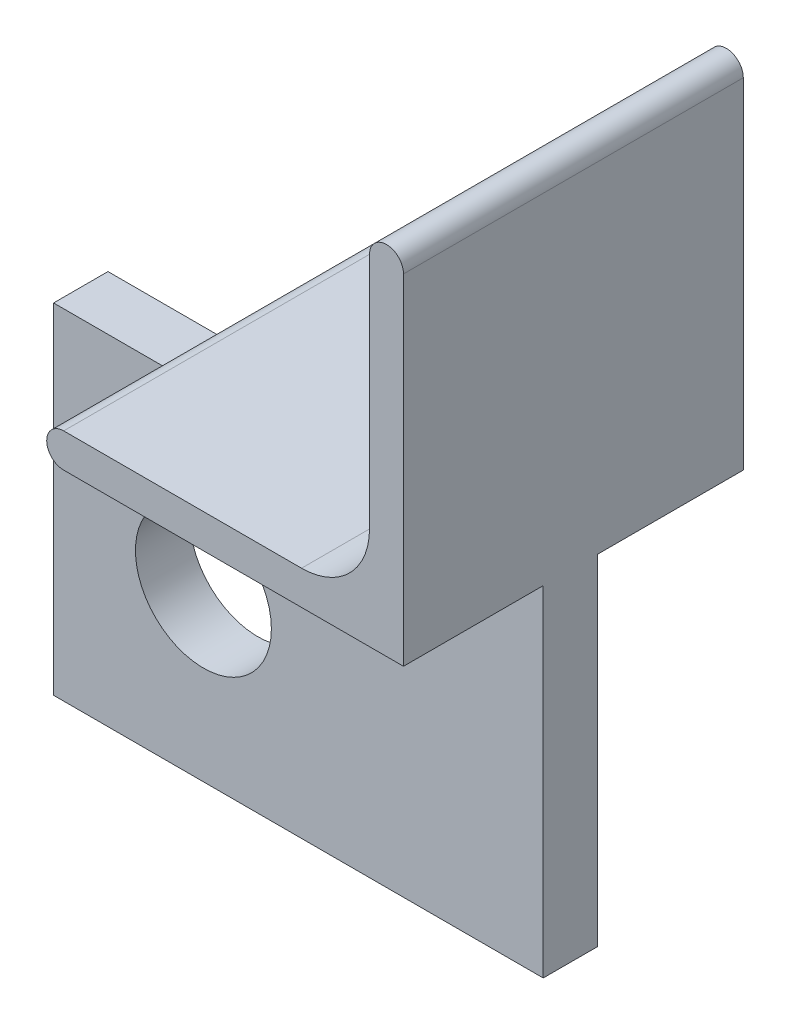
ISO-10303-21;
HEADER;
FILE_DESCRIPTION(('STEP AP214'),'2;1');
FILE_NAME('part.step','',(''),(''),'','','');
FILE_SCHEMA(('AUTOMOTIVE_DESIGN { 1 0 10303 214 1 1 1 1 }'));
ENDSEC;
DATA;
#1=APPLICATION_CONTEXT('core data for automotive mechanical design processes');
#2=APPLICATION_PROTOCOL_DEFINITION('international standard','automotive_design',2000,#1);
#3=PRODUCT_CONTEXT('',#1,'mechanical');
#4=PRODUCT('Part','Part','',(#3));
#5=PRODUCT_RELATED_PRODUCT_CATEGORY('part','',(#4));
#6=PRODUCT_DEFINITION_FORMATION('','',#4);
#7=PRODUCT_DEFINITION_CONTEXT('part definition',#1,'design');
#8=PRODUCT_DEFINITION('design','',#6,#7);
#9=PRODUCT_DEFINITION_SHAPE('','',#8);
#10=(LENGTH_UNIT() NAMED_UNIT(*) SI_UNIT(.MILLI.,.METRE.));
#11=(NAMED_UNIT(*) PLANE_ANGLE_UNIT() SI_UNIT($,.RADIAN.));
#12=(NAMED_UNIT(*) SI_UNIT($,.STERADIAN.) SOLID_ANGLE_UNIT());
#13=UNCERTAINTY_MEASURE_WITH_UNIT(LENGTH_MEASURE(1.E-05),#10,'distance_accuracy_value','');
#14=(GEOMETRIC_REPRESENTATION_CONTEXT(3) GLOBAL_UNCERTAINTY_ASSIGNED_CONTEXT((#13)) GLOBAL_UNIT_ASSIGNED_CONTEXT((#10,
#11,#12)) REPRESENTATION_CONTEXT('',''));
#15=CARTESIAN_POINT('',(0.,0.,0.));
#16=DIRECTION('',(0.,0.,1.));
#17=DIRECTION('',(1.,0.,0.));
#18=AXIS2_PLACEMENT_3D('',#15,#16,#17);
#19=CARTESIAN_POINT('',(0.,0.,25.));
#20=DIRECTION('',(0.,1.,0.));
#21=DIRECTION('',(0.,0.,1.));
#22=AXIS2_PLACEMENT_3D('',#19,#20,#21);
#23=PLANE('',#22);
#24=DIRECTION('',(1.,0.,0.));
#25=VECTOR('',#24,1.);
#26=CARTESIAN_POINT('',(-22.0449248055374,0.,-3.56003445408045));
#27=LINE('',#26,#25);
#28=CARTESIAN_POINT('',(0.,0.,-3.56003445408045));
#29=VERTEX_POINT('',#28);
#30=CARTESIAN_POINT('',(50.,0.,-3.56003445408045));
#31=VERTEX_POINT('',#30);
#32=EDGE_CURVE('E201',#29,#31,#27,.T.);
#33=ORIENTED_EDGE('',*,*,#32,.F.);
#34=DIRECTION('',(0.,0.,-1.));
#35=VECTOR('',#34,1.);
#36=CARTESIAN_POINT('',(0.,0.,25.));
#37=LINE('',#36,#35);
#38=CARTESIAN_POINT('',(0.,0.,-25.));
#39=VERTEX_POINT('',#38);
#40=EDGE_CURVE('E41',#29,#39,#37,.T.);
#41=ORIENTED_EDGE('',*,*,#40,.T.);
#42=DIRECTION('',(1.,0.,0.));
#43=VECTOR('',#42,1.);
#44=CARTESIAN_POINT('',(0.,0.,-25.));
#45=LINE('',#44,#43);
#46=CARTESIAN_POINT('',(50.,0.,-25.));
#47=VERTEX_POINT('',#46);
#48=EDGE_CURVE('E137',#39,#47,#45,.T.);
#49=ORIENTED_EDGE('',*,*,#48,.T.);
#50=DIRECTION('',(0.,0.,-1.));
#51=VECTOR('',#50,1.);
#52=CARTESIAN_POINT('',(50.,0.,25.));
#53=LINE('',#52,#51);
#54=EDGE_CURVE('E155',#31,#47,#53,.T.);
#55=ORIENTED_EDGE('',*,*,#54,.F.);
#56=EDGE_LOOP('',(#33,#41,#49,#55));
#57=FACE_BOUND('',#56,.T.);
#58=ADVANCED_FACE('F33',(#57),#23,.F.);
#59=DIRECTION('',(-1.,0.,0.));
#60=VECTOR('',#59,1.);
#61=CARTESIAN_POINT('',(-22.0449248055374,0.,4.43996554591955));
#62=LINE('',#61,#60);
#63=CARTESIAN_POINT('',(50.,0.,4.43996554591955));
#64=VERTEX_POINT('',#63);
#65=CARTESIAN_POINT('',(0.,0.,4.43996554591955));
#66=VERTEX_POINT('',#65);
#67=EDGE_CURVE('E193',#64,#66,#62,.T.);
#68=ORIENTED_EDGE('',*,*,#67,.F.);
#69=CARTESIAN_POINT('',(50.,0.,25.));
#70=VERTEX_POINT('',#69);
#71=EDGE_CURVE('E156',#70,#64,#53,.T.);
#72=ORIENTED_EDGE('',*,*,#71,.F.);
#73=DIRECTION('',(1.,0.,0.));
#74=VECTOR('',#73,1.);
#75=CARTESIAN_POINT('',(0.,0.,25.));
#76=LINE('',#75,#74);
#77=CARTESIAN_POINT('',(0.,0.,25.));
#78=VERTEX_POINT('',#77);
#79=EDGE_CURVE('E94',#78,#70,#76,.T.);
#80=ORIENTED_EDGE('',*,*,#79,.F.);
#81=EDGE_CURVE('E11',#78,#66,#37,.T.);
#82=ORIENTED_EDGE('',*,*,#81,.T.);
#83=EDGE_LOOP('',(#68,#72,#80,#82));
#84=FACE_BOUND('',#83,.T.);
#85=ADVANCED_FACE('F245',(#84),#23,.F.);
#86=CARTESIAN_POINT('',(0.,2.5,25.));
#87=DIRECTION('',(0.,0.,-1.));
#88=DIRECTION('',(-1.,0.,0.));
#89=AXIS2_PLACEMENT_3D('',#86,#87,#88);
#90=CYLINDRICAL_SURFACE('',#89,2.5);
#91=CARTESIAN_POINT('',(0.,2.5,-25.));
#92=DIRECTION('',(0.,0.,1.));
#93=DIRECTION('',(-1.,0.,0.));
#94=AXIS2_PLACEMENT_3D('',#91,#92,#93);
#95=CIRCLE('',#94,2.5);
#96=CARTESIAN_POINT('',(0.,5.,-25.));
#97=VERTEX_POINT('',#96);
#98=EDGE_CURVE('E134',#97,#39,#95,.T.);
#99=ORIENTED_EDGE('',*,*,#98,.T.);
#100=ORIENTED_EDGE('',*,*,#40,.F.);
#101=DIRECTION('',(0.,0.,-1.));
#102=VECTOR('',#101,1.);
#103=CARTESIAN_POINT('',(0.,0.,25.));
#104=LINE('',#103,#102);
#105=EDGE_CURVE('E138',#66,#29,#104,.T.);
#106=ORIENTED_EDGE('',*,*,#105,.F.);
#107=ORIENTED_EDGE('',*,*,#81,.F.);
#108=CARTESIAN_POINT('',(0.,2.5,25.));
#109=DIRECTION('',(0.,0.,1.));
#110=DIRECTION('',(-1.,0.,0.));
#111=AXIS2_PLACEMENT_3D('',#108,#109,#110);
#112=CIRCLE('',#111,2.5);
#113=CARTESIAN_POINT('',(0.,5.,25.));
#114=VERTEX_POINT('',#113);
#115=EDGE_CURVE('E149',#114,#78,#112,.T.);
#116=ORIENTED_EDGE('',*,*,#115,.F.);
#117=DIRECTION('',(0.,0.,-1.));
#118=VECTOR('',#117,1.);
#119=CARTESIAN_POINT('',(0.,5.,25.));
#120=LINE('',#119,#118);
#121=EDGE_CURVE('E130',#114,#97,#120,.T.);
#122=ORIENTED_EDGE('',*,*,#121,.T.);
#123=EDGE_LOOP('',(#99,#100,#106,#107,#116,#122));
#124=FACE_BOUND('',#123,.T.);
#125=ADVANCED_FACE('F35',(#124),#90,.T.);
#126=CARTESIAN_POINT('',(50.,0.,25.));
#127=DIRECTION('',(-1.,0.,0.));
#128=DIRECTION('',(0.,0.,1.));
#129=AXIS2_PLACEMENT_3D('',#126,#127,#128);
#130=PLANE('',#129);
#131=DIRECTION('',(0.,1.,0.));
#132=VECTOR('',#131,1.);
#133=CARTESIAN_POINT('',(50.,0.,-25.));
#134=LINE('',#133,#132);
#135=CARTESIAN_POINT('',(50.,50.,-25.));
#136=VERTEX_POINT('',#135);
#137=EDGE_CURVE('E141',#47,#136,#134,.T.);
#138=ORIENTED_EDGE('',*,*,#137,.T.);
#139=DIRECTION('',(0.,0.,-1.));
#140=VECTOR('',#139,1.);
#141=CARTESIAN_POINT('',(50.,50.,25.));
#142=LINE('',#141,#140);
#143=CARTESIAN_POINT('',(50.,50.,25.));
#144=VERTEX_POINT('',#143);
#145=EDGE_CURVE('E153',#144,#136,#142,.T.);
#146=ORIENTED_EDGE('',*,*,#145,.F.);
#147=DIRECTION('',(0.,1.,0.));
#148=VECTOR('',#147,1.);
#149=CARTESIAN_POINT('',(50.,0.,25.));
#150=LINE('',#149,#148);
#151=EDGE_CURVE('E175',#70,#144,#150,.T.);
#152=ORIENTED_EDGE('',*,*,#151,.F.);
#153=ORIENTED_EDGE('',*,*,#71,.T.);
#154=DIRECTION('',(0.,1.,0.));
#155=VECTOR('',#154,1.);
#156=CARTESIAN_POINT('',(50.,-50.,4.43996554591955));
#157=LINE('',#156,#155);
#158=CARTESIAN_POINT('',(50.,-50.,4.43996554591955));
#159=VERTEX_POINT('',#158);
#160=EDGE_CURVE('E186',#159,#64,#157,.T.);
#161=ORIENTED_EDGE('',*,*,#160,.F.);
#162=DIRECTION('',(0.,0.,1.));
#163=VECTOR('',#162,1.);
#164=CARTESIAN_POINT('',(50.,-50.,4.43996554591955));
#165=LINE('',#164,#163);
#166=CARTESIAN_POINT('',(50.,-50.,-3.56003445408045));
#167=VERTEX_POINT('',#166);
#168=EDGE_CURVE('E208',#167,#159,#165,.T.);
#169=ORIENTED_EDGE('',*,*,#168,.F.);
#170=DIRECTION('',(0.,1.,0.));
#171=VECTOR('',#170,1.);
#172=CARTESIAN_POINT('',(50.,-50.,-3.56003445408045));
#173=LINE('',#172,#171);
#174=EDGE_CURVE('E48',#167,#31,#173,.T.);
#175=ORIENTED_EDGE('',*,*,#174,.T.);
#176=ORIENTED_EDGE('',*,*,#54,.T.);
#177=EDGE_LOOP('',(#138,#146,#152,#153,#161,#169,#175,#176));
#178=FACE_BOUND('',#177,.T.);
#179=ADVANCED_FACE('F162',(#178),#130,.F.);
#180=CARTESIAN_POINT('',(47.5,50.,25.));
#181=DIRECTION('',(0.,0.,-1.));
#182=DIRECTION('',(-1.,0.,0.));
#183=AXIS2_PLACEMENT_3D('',#180,#181,#182);
#184=CYLINDRICAL_SURFACE('',#183,2.5);
#185=CARTESIAN_POINT('',(47.5,50.,-25.));
#186=DIRECTION('',(0.,0.,1.));
#187=DIRECTION('',(1.,0.,0.));
#188=AXIS2_PLACEMENT_3D('',#185,#186,#187);
#189=CIRCLE('',#188,2.5);
#190=CARTESIAN_POINT('',(45.,50.,-25.));
#191=VERTEX_POINT('',#190);
#192=EDGE_CURVE('E143',#136,#191,#189,.T.);
#193=ORIENTED_EDGE('',*,*,#192,.T.);
#194=DIRECTION('',(0.,0.,-1.));
#195=VECTOR('',#194,1.);
#196=CARTESIAN_POINT('',(45.,50.,25.));
#197=LINE('',#196,#195);
#198=CARTESIAN_POINT('',(45.,50.,25.));
#199=VERTEX_POINT('',#198);
#200=EDGE_CURVE('E125',#199,#191,#197,.T.);
#201=ORIENTED_EDGE('',*,*,#200,.F.);
#202=CARTESIAN_POINT('',(47.5,50.,25.));
#203=DIRECTION('',(0.,0.,1.));
#204=DIRECTION('',(1.,0.,0.));
#205=AXIS2_PLACEMENT_3D('',#202,#203,#204);
#206=CIRCLE('',#205,2.5);
#207=EDGE_CURVE('E113',#144,#199,#206,.T.);
#208=ORIENTED_EDGE('',*,*,#207,.F.);
#209=ORIENTED_EDGE('',*,*,#145,.T.);
#210=EDGE_LOOP('',(#193,#201,#208,#209));
#211=FACE_BOUND('',#210,.T.);
#212=ADVANCED_FACE('F174',(#211),#184,.T.);
#213=CARTESIAN_POINT('',(45.,15.0000000000001,25.));
#214=DIRECTION('',(1.,0.,0.));
#215=DIRECTION('',(0.,0.,-1.));
#216=AXIS2_PLACEMENT_3D('',#213,#214,#215);
#217=PLANE('',#216);
#218=DIRECTION('',(0.,-1.,0.));
#219=VECTOR('',#218,1.);
#220=CARTESIAN_POINT('',(45.,15.0000000000001,-25.));
#221=LINE('',#220,#219);
#222=CARTESIAN_POINT('',(45.,15.0000000000001,-25.));
#223=VERTEX_POINT('',#222);
#224=EDGE_CURVE('E122',#191,#223,#221,.T.);
#225=ORIENTED_EDGE('',*,*,#224,.T.);
#226=DIRECTION('',(0.,0.,-1.));
#227=VECTOR('',#226,1.);
#228=CARTESIAN_POINT('',(45.,15.0000000000001,25.));
#229=LINE('',#228,#227);
#230=CARTESIAN_POINT('',(45.,15.0000000000001,25.));
#231=VERTEX_POINT('',#230);
#232=EDGE_CURVE('E119',#231,#223,#229,.T.);
#233=ORIENTED_EDGE('',*,*,#232,.F.);
#234=DIRECTION('',(0.,-1.,0.));
#235=VECTOR('',#234,1.);
#236=CARTESIAN_POINT('',(45.,15.0000000000001,25.));
#237=LINE('',#236,#235);
#238=EDGE_CURVE('E106',#199,#231,#237,.T.);
#239=ORIENTED_EDGE('',*,*,#238,.F.);
#240=ORIENTED_EDGE('',*,*,#200,.T.);
#241=EDGE_LOOP('',(#225,#233,#239,#240));
#242=FACE_BOUND('',#241,.T.);
#243=ADVANCED_FACE('F120',(#242),#217,.F.);
#244=CARTESIAN_POINT('',(35.,15.,25.));
#245=DIRECTION('',(0.,0.,-1.));
#246=DIRECTION('',(-1.,0.,0.));
#247=AXIS2_PLACEMENT_3D('',#244,#245,#246);
#248=CYLINDRICAL_SURFACE('',#247,10.);
#249=CARTESIAN_POINT('',(35.,15.,-25.));
#250=DIRECTION('',(0.,0.,-1.));
#251=DIRECTION('',(1.,0.,0.));
#252=AXIS2_PLACEMENT_3D('',#249,#250,#251);
#253=CIRCLE('',#252,10.);
#254=CARTESIAN_POINT('',(34.9999999999999,5.,-25.));
#255=VERTEX_POINT('',#254);
#256=EDGE_CURVE('E146',#223,#255,#253,.T.);
#257=ORIENTED_EDGE('',*,*,#256,.T.);
#258=DIRECTION('',(0.,0.,-1.));
#259=VECTOR('',#258,1.);
#260=CARTESIAN_POINT('',(34.9999999999999,5.,25.));
#261=LINE('',#260,#259);
#262=CARTESIAN_POINT('',(34.9999999999999,5.,25.));
#263=VERTEX_POINT('',#262);
#264=EDGE_CURVE('E126',#263,#255,#261,.T.);
#265=ORIENTED_EDGE('',*,*,#264,.F.);
#266=CARTESIAN_POINT('',(35.,15.,25.));
#267=DIRECTION('',(0.,0.,-1.));
#268=DIRECTION('',(1.,0.,0.));
#269=AXIS2_PLACEMENT_3D('',#266,#267,#268);
#270=CIRCLE('',#269,10.);
#271=EDGE_CURVE('E110',#231,#263,#270,.T.);
#272=ORIENTED_EDGE('',*,*,#271,.F.);
#273=ORIENTED_EDGE('',*,*,#232,.T.);
#274=EDGE_LOOP('',(#257,#265,#272,#273));
#275=FACE_BOUND('',#274,.T.);
#276=ADVANCED_FACE('F128',(#275),#248,.F.);
#277=CARTESIAN_POINT('',(0.,5.,25.));
#278=DIRECTION('',(0.,-1.,0.));
#279=DIRECTION('',(0.,0.,-1.));
#280=AXIS2_PLACEMENT_3D('',#277,#278,#279);
#281=PLANE('',#280);
#282=DIRECTION('',(-1.,0.,0.));
#283=VECTOR('',#282,1.);
#284=CARTESIAN_POINT('',(0.,5.,-25.));
#285=LINE('',#284,#283);
#286=EDGE_CURVE('E86',#255,#97,#285,.T.);
#287=ORIENTED_EDGE('',*,*,#286,.T.);
#288=ORIENTED_EDGE('',*,*,#121,.F.);
#289=DIRECTION('',(-1.,0.,0.));
#290=VECTOR('',#289,1.);
#291=CARTESIAN_POINT('',(0.,5.,25.));
#292=LINE('',#291,#290);
#293=EDGE_CURVE('E57',#263,#114,#292,.T.);
#294=ORIENTED_EDGE('',*,*,#293,.F.);
#295=ORIENTED_EDGE('',*,*,#264,.T.);
#296=EDGE_LOOP('',(#287,#288,#294,#295));
#297=FACE_BOUND('',#296,.T.);
#298=ADVANCED_FACE('F260',(#297),#281,.F.);
#299=CARTESIAN_POINT('',(0.,2.5,25.));
#300=DIRECTION('',(0.,0.,-1.));
#301=DIRECTION('',(-1.,0.,0.));
#302=AXIS2_PLACEMENT_3D('',#299,#300,#301);
#303=PLANE('',#302);
#304=ORIENTED_EDGE('',*,*,#115,.T.);
#305=ORIENTED_EDGE('',*,*,#79,.T.);
#306=ORIENTED_EDGE('',*,*,#151,.T.);
#307=ORIENTED_EDGE('',*,*,#207,.T.);
#308=ORIENTED_EDGE('',*,*,#238,.T.);
#309=ORIENTED_EDGE('',*,*,#271,.T.);
#310=ORIENTED_EDGE('',*,*,#293,.T.);
#311=EDGE_LOOP('',(#304,#305,#306,#307,#308,#309,#310));
#312=FACE_BOUND('',#311,.T.);
#313=ADVANCED_FACE('F108',(#312),#303,.F.);
#314=CARTESIAN_POINT('',(0.,2.5,-25.));
#315=DIRECTION('',(0.,0.,-1.));
#316=DIRECTION('',(-1.,0.,0.));
#317=AXIS2_PLACEMENT_3D('',#314,#315,#316);
#318=PLANE('',#317);
#319=ORIENTED_EDGE('',*,*,#98,.F.);
#320=ORIENTED_EDGE('',*,*,#286,.F.);
#321=ORIENTED_EDGE('',*,*,#256,.F.);
#322=ORIENTED_EDGE('',*,*,#224,.F.);
#323=ORIENTED_EDGE('',*,*,#192,.F.);
#324=ORIENTED_EDGE('',*,*,#137,.F.);
#325=ORIENTED_EDGE('',*,*,#48,.F.);
#326=EDGE_LOOP('',(#319,#320,#321,#322,#323,#324,#325));
#327=FACE_BOUND('',#326,.T.);
#328=ADVANCED_FACE('F172',(#327),#318,.T.);
#329=CARTESIAN_POINT('',(0.,0.,0.));
#330=DIRECTION('',(0.,-1.,0.));
#331=DIRECTION('',(0.,0.,-1.));
#332=AXIS2_PLACEMENT_3D('',#329,#330,#331);
#333=PLANE('',#332);
#334=CARTESIAN_POINT('',(-22.0449248055374,0.,4.43996554591955));
#335=VERTEX_POINT('',#334);
#336=EDGE_CURVE('E197',#66,#335,#62,.T.);
#337=ORIENTED_EDGE('',*,*,#336,.F.);
#338=ORIENTED_EDGE('',*,*,#105,.T.);
#339=CARTESIAN_POINT('',(-22.0449248055374,0.,-3.56003445408045));
#340=VERTEX_POINT('',#339);
#341=EDGE_CURVE('E198',#340,#29,#27,.T.);
#342=ORIENTED_EDGE('',*,*,#341,.F.);
#343=DIRECTION('',(0.,0.,-1.));
#344=VECTOR('',#343,1.);
#345=CARTESIAN_POINT('',(-22.0449248055374,0.,4.43996554591955));
#346=LINE('',#345,#344);
#347=EDGE_CURVE('E202',#335,#340,#346,.T.);
#348=ORIENTED_EDGE('',*,*,#347,.F.);
#349=EDGE_LOOP('',(#337,#338,#342,#348));
#350=FACE_BOUND('',#349,.T.);
#351=ADVANCED_FACE('F265',(#350),#333,.F.);
#352=CARTESIAN_POINT('',(-22.0449248055374,-50.,4.43996554591955));
#353=DIRECTION('',(1.,0.,0.));
#354=DIRECTION('',(0.,0.,-1.));
#355=AXIS2_PLACEMENT_3D('',#352,#353,#354);
#356=PLANE('',#355);
#357=ORIENTED_EDGE('',*,*,#347,.T.);
#358=DIRECTION('',(0.,1.,0.));
#359=VECTOR('',#358,1.);
#360=CARTESIAN_POINT('',(-22.0449248055374,-50.,-3.56003445408045));
#361=LINE('',#360,#359);
#362=CARTESIAN_POINT('',(-22.0449248055374,-50.,-3.56003445408045));
#363=VERTEX_POINT('',#362);
#364=EDGE_CURVE('E182',#363,#340,#361,.T.);
#365=ORIENTED_EDGE('',*,*,#364,.F.);
#366=DIRECTION('',(0.,0.,-1.));
#367=VECTOR('',#366,1.);
#368=CARTESIAN_POINT('',(-22.0449248055374,-50.,4.43996554591955));
#369=LINE('',#368,#367);
#370=CARTESIAN_POINT('',(-22.0449248055374,-50.,4.43996554591955));
#371=VERTEX_POINT('',#370);
#372=EDGE_CURVE('E196',#371,#363,#369,.T.);
#373=ORIENTED_EDGE('',*,*,#372,.F.);
#374=DIRECTION('',(0.,1.,0.));
#375=VECTOR('',#374,1.);
#376=CARTESIAN_POINT('',(-22.0449248055374,-50.,4.43996554591955));
#377=LINE('',#376,#375);
#378=EDGE_CURVE('E189',#371,#335,#377,.T.);
#379=ORIENTED_EDGE('',*,*,#378,.T.);
#380=EDGE_LOOP('',(#357,#365,#373,#379));
#381=FACE_BOUND('',#380,.T.);
#382=ADVANCED_FACE('F268',(#381),#356,.F.);
#383=CARTESIAN_POINT('',(-22.0449248055374,-50.,-3.56003445408045));
#384=DIRECTION('',(0.,0.,1.));
#385=DIRECTION('',(1.,0.,0.));
#386=AXIS2_PLACEMENT_3D('',#383,#384,#385);
#387=PLANE('',#386);
#388=CARTESIAN_POINT('',(0.,-25.510653738939,-3.56003445408046));
#389=DIRECTION('',(0.,0.,1.));
#390=DIRECTION('',(1.,0.,0.));
#391=AXIS2_PLACEMENT_3D('',#388,#389,#390);
#392=CIRCLE('',#391,10.);
#393=CARTESIAN_POINT('',(10.,-25.510653738939,-3.56003445408046));
#394=VERTEX_POINT('',#393);
#395=EDGE_CURVE('E205',#394,#394,#392,.T.);
#396=ORIENTED_EDGE('',*,*,#395,.T.);
#397=EDGE_LOOP('',(#396));
#398=FACE_BOUND('',#397,.T.);
#399=ORIENTED_EDGE('',*,*,#341,.T.);
#400=ORIENTED_EDGE('',*,*,#32,.T.);
#401=ORIENTED_EDGE('',*,*,#174,.F.);
#402=DIRECTION('',(1.,0.,0.));
#403=VECTOR('',#402,1.);
#404=CARTESIAN_POINT('',(-22.0449248055374,-50.,-3.56003445408045));
#405=LINE('',#404,#403);
#406=EDGE_CURVE('E211',#363,#167,#405,.T.);
#407=ORIENTED_EDGE('',*,*,#406,.F.);
#408=ORIENTED_EDGE('',*,*,#364,.T.);
#409=EDGE_LOOP('',(#399,#400,#401,#407,#408));
#410=FACE_BOUND('',#409,.T.);
#411=ADVANCED_FACE('F229',(#398,#410),#387,.F.);
#412=CARTESIAN_POINT('',(-22.0449248055374,-50.,4.43996554591955));
#413=DIRECTION('',(0.,0.,-1.));
#414=DIRECTION('',(-1.,0.,0.));
#415=AXIS2_PLACEMENT_3D('',#412,#413,#414);
#416=PLANE('',#415);
#417=CARTESIAN_POINT('',(0.,-25.510653738939,4.43996554591955));
#418=DIRECTION('',(0.,0.,1.));
#419=DIRECTION('',(1.,0.,0.));
#420=AXIS2_PLACEMENT_3D('',#417,#418,#419);
#421=CIRCLE('',#420,10.);
#422=CARTESIAN_POINT('',(10.,-25.510653738939,4.43996554591955));
#423=VERTEX_POINT('',#422);
#424=EDGE_CURVE('E218',#423,#423,#421,.T.);
#425=ORIENTED_EDGE('',*,*,#424,.F.);
#426=EDGE_LOOP('',(#425));
#427=FACE_BOUND('',#426,.T.);
#428=ORIENTED_EDGE('',*,*,#67,.T.);
#429=ORIENTED_EDGE('',*,*,#336,.T.);
#430=ORIENTED_EDGE('',*,*,#378,.F.);
#431=DIRECTION('',(-1.,0.,0.));
#432=VECTOR('',#431,1.);
#433=CARTESIAN_POINT('',(-22.0449248055374,-50.,4.43996554591955));
#434=LINE('',#433,#432);
#435=EDGE_CURVE('E192',#159,#371,#434,.T.);
#436=ORIENTED_EDGE('',*,*,#435,.F.);
#437=ORIENTED_EDGE('',*,*,#160,.T.);
#438=EDGE_LOOP('',(#428,#429,#430,#436,#437));
#439=FACE_BOUND('',#438,.T.);
#440=ADVANCED_FACE('F225',(#427,#439),#416,.F.);
#441=CARTESIAN_POINT('',(0.,-50.,0.));
#442=DIRECTION('',(0.,-1.,0.));
#443=DIRECTION('',(0.,0.,-1.));
#444=AXIS2_PLACEMENT_3D('',#441,#442,#443);
#445=PLANE('',#444);
#446=ORIENTED_EDGE('',*,*,#372,.T.);
#447=ORIENTED_EDGE('',*,*,#406,.T.);
#448=ORIENTED_EDGE('',*,*,#168,.T.);
#449=ORIENTED_EDGE('',*,*,#435,.T.);
#450=EDGE_LOOP('',(#446,#447,#448,#449));
#451=FACE_BOUND('',#450,.T.);
#452=ADVANCED_FACE('F228',(#451),#445,.T.);
#453=CARTESIAN_POINT('',(0.,-25.510653738939,-45.5600344540805));
#454=DIRECTION('',(0.,0.,1.));
#455=DIRECTION('',(1.,0.,0.));
#456=AXIS2_PLACEMENT_3D('',#453,#454,#455);
#457=CYLINDRICAL_SURFACE('',#456,10.);
#458=ORIENTED_EDGE('',*,*,#424,.T.);
#459=EDGE_LOOP('',(#458));
#460=FACE_BOUND('',#459,.T.);
#461=ORIENTED_EDGE('',*,*,#395,.F.);
#462=EDGE_LOOP('',(#461));
#463=FACE_BOUND('',#462,.T.);
#464=ADVANCED_FACE('F222',(#460,#463),#457,.F.);
#465=CLOSED_SHELL('',(#58,#85,#125,#179,#212,#243,#276,#298,#313,#328,#351,#382,#411,#440,#452,#464));
#466=MANIFOLD_SOLID_BREP('B2',#465);
#467=ADVANCED_BREP_SHAPE_REPRESENTATION('',(#18,#466),#14);
#468=SHAPE_DEFINITION_REPRESENTATION(#9,#467);
ENDSEC;
END-ISO-10303-21;
